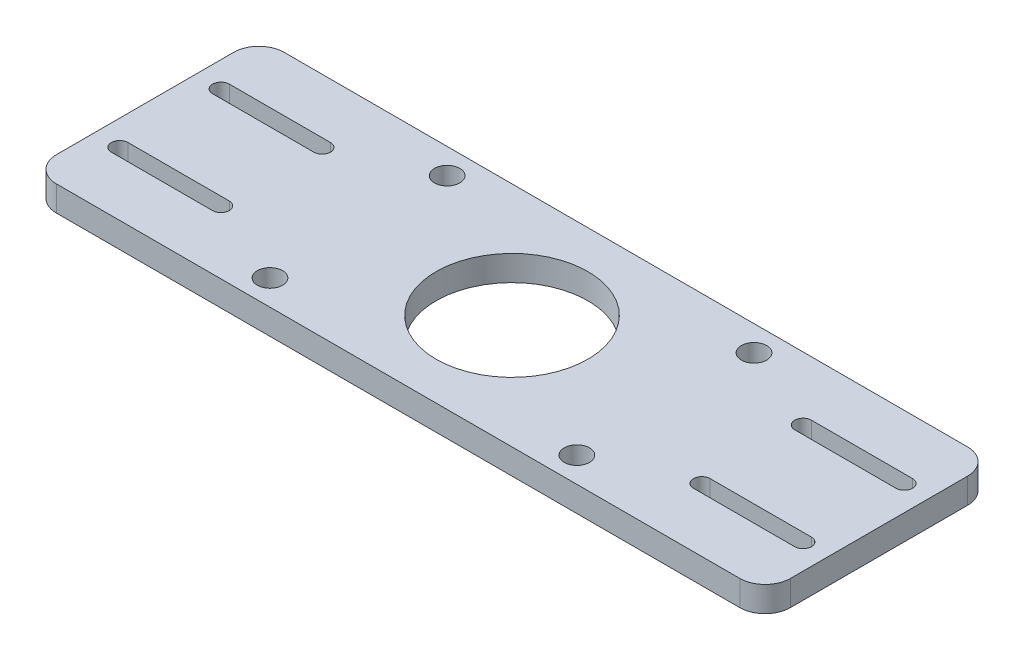
ISO-10303-21;
HEADER;
FILE_DESCRIPTION(('STEP AP214'),'2;1');
FILE_NAME('part.step','',(''),(''),'','','');
FILE_SCHEMA(('AUTOMOTIVE_DESIGN { 1 0 10303 214 1 1 1 1 }'));
ENDSEC;
DATA;
#1=APPLICATION_CONTEXT('core data for automotive mechanical design processes');
#2=APPLICATION_PROTOCOL_DEFINITION('international standard','automotive_design',2000,#1);
#3=PRODUCT_CONTEXT('',#1,'mechanical');
#4=PRODUCT('Part','Part','',(#3));
#5=PRODUCT_RELATED_PRODUCT_CATEGORY('part','',(#4));
#6=PRODUCT_DEFINITION_FORMATION('','',#4);
#7=PRODUCT_DEFINITION_CONTEXT('part definition',#1,'design');
#8=PRODUCT_DEFINITION('design','',#6,#7);
#9=PRODUCT_DEFINITION_SHAPE('','',#8);
#10=(LENGTH_UNIT() NAMED_UNIT(*) SI_UNIT(.MILLI.,.METRE.));
#11=(NAMED_UNIT(*) PLANE_ANGLE_UNIT() SI_UNIT($,.RADIAN.));
#12=(NAMED_UNIT(*) SI_UNIT($,.STERADIAN.) SOLID_ANGLE_UNIT());
#13=UNCERTAINTY_MEASURE_WITH_UNIT(LENGTH_MEASURE(1.E-05),#10,'distance_accuracy_value','');
#14=(GEOMETRIC_REPRESENTATION_CONTEXT(3) GLOBAL_UNCERTAINTY_ASSIGNED_CONTEXT((#13)) GLOBAL_UNIT_ASSIGNED_CONTEXT((#10,
#11,#12)) REPRESENTATION_CONTEXT('',''));
#15=CARTESIAN_POINT('',(0.,0.,0.));
#16=DIRECTION('',(0.,0.,1.));
#17=DIRECTION('',(1.,0.,0.));
#18=AXIS2_PLACEMENT_3D('',#15,#16,#17);
#19=CARTESIAN_POINT('',(67.5,5.,17.5));
#20=DIRECTION('',(0.,1.,0.));
#21=DIRECTION('',(0.,0.,1.));
#22=AXIS2_PLACEMENT_3D('',#19,#20,#21);
#23=CYLINDRICAL_SURFACE('',#22,5.);
#24=DIRECTION('',(0.,1.,0.));
#25=VECTOR('',#24,1.);
#26=CARTESIAN_POINT('',(67.5,5.,22.5));
#27=LINE('',#26,#25);
#28=CARTESIAN_POINT('',(67.5,0.,22.5));
#29=VERTEX_POINT('',#28);
#30=CARTESIAN_POINT('',(67.5,5.,22.5));
#31=VERTEX_POINT('',#30);
#32=EDGE_CURVE('E385',#29,#31,#27,.T.);
#33=ORIENTED_EDGE('',*,*,#32,.F.);
#34=CARTESIAN_POINT('',(67.5,0.,17.5));
#35=DIRECTION('',(0.,1.,0.));
#36=DIRECTION('',(0.,0.,1.));
#37=AXIS2_PLACEMENT_3D('',#34,#35,#36);
#38=CIRCLE('',#37,5.);
#39=CARTESIAN_POINT('',(72.5,0.,17.5));
#40=VERTEX_POINT('',#39);
#41=EDGE_CURVE('E40',#40,#29,#38,.F.);
#42=ORIENTED_EDGE('',*,*,#41,.F.);
#43=DIRECTION('',(0.,1.,0.));
#44=VECTOR('',#43,1.);
#45=CARTESIAN_POINT('',(72.5,5.,17.5));
#46=LINE('',#45,#44);
#47=CARTESIAN_POINT('',(72.5,5.,17.5));
#48=VERTEX_POINT('',#47);
#49=EDGE_CURVE('E388',#48,#40,#46,.F.);
#50=ORIENTED_EDGE('',*,*,#49,.F.);
#51=CARTESIAN_POINT('',(67.5,5.,17.5));
#52=DIRECTION('',(0.,1.,0.));
#53=DIRECTION('',(0.,0.,1.));
#54=AXIS2_PLACEMENT_3D('',#51,#52,#53);
#55=CIRCLE('',#54,5.);
#56=EDGE_CURVE('E11',#31,#48,#55,.T.);
#57=ORIENTED_EDGE('',*,*,#56,.F.);
#58=EDGE_LOOP('',(#33,#42,#50,#57));
#59=FACE_BOUND('',#58,.T.);
#60=ADVANCED_FACE('F33',(#59),#23,.T.);
#61=CARTESIAN_POINT('',(-67.5,5.,17.5));
#62=DIRECTION('',(0.,1.,0.));
#63=DIRECTION('',(0.,0.,1.));
#64=AXIS2_PLACEMENT_3D('',#61,#62,#63);
#65=CYLINDRICAL_SURFACE('',#64,5.);
#66=DIRECTION('',(0.,1.,0.));
#67=VECTOR('',#66,1.);
#68=CARTESIAN_POINT('',(-72.5,5.,17.5));
#69=LINE('',#68,#67);
#70=CARTESIAN_POINT('',(-72.5,0.,17.5));
#71=VERTEX_POINT('',#70);
#72=CARTESIAN_POINT('',(-72.5,5.,17.5));
#73=VERTEX_POINT('',#72);
#74=EDGE_CURVE('E375',#71,#73,#69,.T.);
#75=ORIENTED_EDGE('',*,*,#74,.F.);
#76=CARTESIAN_POINT('',(-67.5,0.,17.5));
#77=DIRECTION('',(0.,1.,0.));
#78=DIRECTION('',(0.,0.,1.));
#79=AXIS2_PLACEMENT_3D('',#76,#77,#78);
#80=CIRCLE('',#79,5.);
#81=CARTESIAN_POINT('',(-67.5,0.,22.5));
#82=VERTEX_POINT('',#81);
#83=EDGE_CURVE('E381',#82,#71,#80,.F.);
#84=ORIENTED_EDGE('',*,*,#83,.F.);
#85=DIRECTION('',(0.,1.,0.));
#86=VECTOR('',#85,1.);
#87=CARTESIAN_POINT('',(-67.5,5.,22.5));
#88=LINE('',#87,#86);
#89=CARTESIAN_POINT('',(-67.5,5.,22.5));
#90=VERTEX_POINT('',#89);
#91=EDGE_CURVE('E378',#90,#82,#88,.F.);
#92=ORIENTED_EDGE('',*,*,#91,.F.);
#93=CARTESIAN_POINT('',(-67.5,5.,17.5));
#94=DIRECTION('',(0.,1.,0.));
#95=DIRECTION('',(0.,0.,1.));
#96=AXIS2_PLACEMENT_3D('',#93,#94,#95);
#97=CIRCLE('',#96,5.);
#98=EDGE_CURVE('E383',#73,#90,#97,.T.);
#99=ORIENTED_EDGE('',*,*,#98,.F.);
#100=EDGE_LOOP('',(#75,#84,#92,#99));
#101=FACE_BOUND('',#100,.T.);
#102=ADVANCED_FACE('F398',(#101),#65,.T.);
#103=CARTESIAN_POINT('',(-67.5,5.,-17.5));
#104=DIRECTION('',(0.,1.,0.));
#105=DIRECTION('',(0.,0.,1.));
#106=AXIS2_PLACEMENT_3D('',#103,#104,#105);
#107=CYLINDRICAL_SURFACE('',#106,5.);
#108=DIRECTION('',(0.,1.,0.));
#109=VECTOR('',#108,1.);
#110=CARTESIAN_POINT('',(-67.5,5.,-22.5));
#111=LINE('',#110,#109);
#112=CARTESIAN_POINT('',(-67.5,0.,-22.5));
#113=VERTEX_POINT('',#112);
#114=CARTESIAN_POINT('',(-67.5,5.,-22.5));
#115=VERTEX_POINT('',#114);
#116=EDGE_CURVE('E365',#113,#115,#111,.T.);
#117=ORIENTED_EDGE('',*,*,#116,.F.);
#118=CARTESIAN_POINT('',(-67.5,0.,-17.5));
#119=DIRECTION('',(0.,1.,0.));
#120=DIRECTION('',(0.,0.,1.));
#121=AXIS2_PLACEMENT_3D('',#118,#119,#120);
#122=CIRCLE('',#121,5.);
#123=CARTESIAN_POINT('',(-72.5,0.,-17.5));
#124=VERTEX_POINT('',#123);
#125=EDGE_CURVE('E371',#124,#113,#122,.F.);
#126=ORIENTED_EDGE('',*,*,#125,.F.);
#127=DIRECTION('',(0.,1.,0.));
#128=VECTOR('',#127,1.);
#129=CARTESIAN_POINT('',(-72.5,5.,-17.5));
#130=LINE('',#129,#128);
#131=CARTESIAN_POINT('',(-72.5,5.,-17.5));
#132=VERTEX_POINT('',#131);
#133=EDGE_CURVE('E368',#132,#124,#130,.F.);
#134=ORIENTED_EDGE('',*,*,#133,.F.);
#135=CARTESIAN_POINT('',(-67.5,5.,-17.5));
#136=DIRECTION('',(0.,1.,0.));
#137=DIRECTION('',(0.,0.,1.));
#138=AXIS2_PLACEMENT_3D('',#135,#136,#137);
#139=CIRCLE('',#138,5.);
#140=EDGE_CURVE('E373',#115,#132,#139,.T.);
#141=ORIENTED_EDGE('',*,*,#140,.F.);
#142=EDGE_LOOP('',(#117,#126,#134,#141));
#143=FACE_BOUND('',#142,.T.);
#144=ADVANCED_FACE('F407',(#143),#107,.T.);
#145=CARTESIAN_POINT('',(67.5,5.,-17.5));
#146=DIRECTION('',(0.,1.,0.));
#147=DIRECTION('',(0.,0.,1.));
#148=AXIS2_PLACEMENT_3D('',#145,#146,#147);
#149=CYLINDRICAL_SURFACE('',#148,5.);
#150=DIRECTION('',(0.,1.,0.));
#151=VECTOR('',#150,1.);
#152=CARTESIAN_POINT('',(72.5,5.,-17.5));
#153=LINE('',#152,#151);
#154=CARTESIAN_POINT('',(72.5,0.,-17.5));
#155=VERTEX_POINT('',#154);
#156=CARTESIAN_POINT('',(72.5,5.,-17.5));
#157=VERTEX_POINT('',#156);
#158=EDGE_CURVE('E345',#155,#157,#153,.T.);
#159=ORIENTED_EDGE('',*,*,#158,.F.);
#160=CARTESIAN_POINT('',(67.5,0.,-17.5));
#161=DIRECTION('',(0.,1.,0.));
#162=DIRECTION('',(0.,0.,1.));
#163=AXIS2_PLACEMENT_3D('',#160,#161,#162);
#164=CIRCLE('',#163,5.);
#165=CARTESIAN_POINT('',(67.5,0.,-22.5));
#166=VERTEX_POINT('',#165);
#167=EDGE_CURVE('E360',#166,#155,#164,.F.);
#168=ORIENTED_EDGE('',*,*,#167,.F.);
#169=DIRECTION('',(0.,1.,0.));
#170=VECTOR('',#169,1.);
#171=CARTESIAN_POINT('',(67.5,5.,-22.5));
#172=LINE('',#171,#170);
#173=CARTESIAN_POINT('',(67.5,5.,-22.5));
#174=VERTEX_POINT('',#173);
#175=EDGE_CURVE('E357',#174,#166,#172,.F.);
#176=ORIENTED_EDGE('',*,*,#175,.F.);
#177=CARTESIAN_POINT('',(67.5,5.,-17.5));
#178=DIRECTION('',(0.,1.,0.));
#179=DIRECTION('',(0.,0.,1.));
#180=AXIS2_PLACEMENT_3D('',#177,#178,#179);
#181=CIRCLE('',#180,5.);
#182=EDGE_CURVE('E363',#157,#174,#181,.T.);
#183=ORIENTED_EDGE('',*,*,#182,.F.);
#184=EDGE_LOOP('',(#159,#168,#176,#183));
#185=FACE_BOUND('',#184,.T.);
#186=ADVANCED_FACE('F415',(#185),#149,.T.);
#187=CARTESIAN_POINT('',(-72.5,5.,22.5));
#188=DIRECTION('',(1.,0.,0.));
#189=DIRECTION('',(0.,0.,-1.));
#190=AXIS2_PLACEMENT_3D('',#187,#188,#189);
#191=PLANE('',#190);
#192=DIRECTION('',(0.,0.,1.));
#193=VECTOR('',#192,1.);
#194=CARTESIAN_POINT('',(-72.5,0.,22.5));
#195=LINE('',#194,#193);
#196=EDGE_CURVE('E327',#124,#71,#195,.T.);
#197=ORIENTED_EDGE('',*,*,#196,.T.);
#198=ORIENTED_EDGE('',*,*,#74,.T.);
#199=DIRECTION('',(0.,0.,1.));
#200=VECTOR('',#199,1.);
#201=CARTESIAN_POINT('',(-72.5,5.,22.5));
#202=LINE('',#201,#200);
#203=EDGE_CURVE('E334',#132,#73,#202,.T.);
#204=ORIENTED_EDGE('',*,*,#203,.F.);
#205=ORIENTED_EDGE('',*,*,#133,.T.);
#206=EDGE_LOOP('',(#197,#198,#204,#205));
#207=FACE_BOUND('',#206,.T.);
#208=ADVANCED_FACE('F403',(#207),#191,.F.);
#209=CARTESIAN_POINT('',(72.5,5.,22.5));
#210=DIRECTION('',(0.,0.,-1.));
#211=DIRECTION('',(-1.,0.,0.));
#212=AXIS2_PLACEMENT_3D('',#209,#210,#211);
#213=PLANE('',#212);
#214=DIRECTION('',(1.,0.,0.));
#215=VECTOR('',#214,1.);
#216=CARTESIAN_POINT('',(72.5,0.,22.5));
#217=LINE('',#216,#215);
#218=EDGE_CURVE('E348',#82,#29,#217,.T.);
#219=ORIENTED_EDGE('',*,*,#218,.T.);
#220=ORIENTED_EDGE('',*,*,#32,.T.);
#221=DIRECTION('',(1.,0.,0.));
#222=VECTOR('',#221,1.);
#223=CARTESIAN_POINT('',(72.5,5.,22.5));
#224=LINE('',#223,#222);
#225=EDGE_CURVE('E337',#90,#31,#224,.T.);
#226=ORIENTED_EDGE('',*,*,#225,.F.);
#227=ORIENTED_EDGE('',*,*,#91,.T.);
#228=EDGE_LOOP('',(#219,#220,#226,#227));
#229=FACE_BOUND('',#228,.T.);
#230=ADVANCED_FACE('F394',(#229),#213,.F.);
#231=CARTESIAN_POINT('',(72.5,5.,22.5));
#232=DIRECTION('',(-1.,0.,0.));
#233=DIRECTION('',(0.,0.,1.));
#234=AXIS2_PLACEMENT_3D('',#231,#232,#233);
#235=PLANE('',#234);
#236=DIRECTION('',(0.,0.,-1.));
#237=VECTOR('',#236,1.);
#238=CARTESIAN_POINT('',(72.5,5.,22.5));
#239=LINE('',#238,#237);
#240=EDGE_CURVE('E340',#48,#157,#239,.T.);
#241=ORIENTED_EDGE('',*,*,#240,.F.);
#242=ORIENTED_EDGE('',*,*,#49,.T.);
#243=DIRECTION('',(0.,0.,-1.));
#244=VECTOR('',#243,1.);
#245=CARTESIAN_POINT('',(72.5,0.,22.5));
#246=LINE('',#245,#244);
#247=EDGE_CURVE('E351',#40,#155,#246,.T.);
#248=ORIENTED_EDGE('',*,*,#247,.T.);
#249=ORIENTED_EDGE('',*,*,#158,.T.);
#250=EDGE_LOOP('',(#241,#242,#248,#249));
#251=FACE_BOUND('',#250,.T.);
#252=ADVANCED_FACE('F418',(#251),#235,.F.);
#253=CARTESIAN_POINT('',(72.5,5.,-22.5));
#254=DIRECTION('',(0.,0.,1.));
#255=DIRECTION('',(1.,0.,0.));
#256=AXIS2_PLACEMENT_3D('',#253,#254,#255);
#257=PLANE('',#256);
#258=DIRECTION('',(-1.,0.,0.));
#259=VECTOR('',#258,1.);
#260=CARTESIAN_POINT('',(72.5,0.,-22.5));
#261=LINE('',#260,#259);
#262=EDGE_CURVE('E338',#166,#113,#261,.T.);
#263=ORIENTED_EDGE('',*,*,#262,.T.);
#264=ORIENTED_EDGE('',*,*,#116,.T.);
#265=DIRECTION('',(-1.,0.,0.));
#266=VECTOR('',#265,1.);
#267=CARTESIAN_POINT('',(72.5,5.,-22.5));
#268=LINE('',#267,#266);
#269=EDGE_CURVE('E342',#174,#115,#268,.T.);
#270=ORIENTED_EDGE('',*,*,#269,.F.);
#271=ORIENTED_EDGE('',*,*,#175,.T.);
#272=EDGE_LOOP('',(#263,#264,#270,#271));
#273=FACE_BOUND('',#272,.T.);
#274=ADVANCED_FACE('F410',(#273),#257,.F.);
#275=CARTESIAN_POINT('',(0.,5.,0.));
#276=DIRECTION('',(0.,1.,0.));
#277=DIRECTION('',(0.,0.,1.));
#278=AXIS2_PLACEMENT_3D('',#275,#276,#277);
#279=PLANE('',#278);
#280=CARTESIAN_POINT('',(0.,5.,0.));
#281=DIRECTION('',(0.,1.,0.));
#282=DIRECTION('',(0.,0.,1.));
#283=AXIS2_PLACEMENT_3D('',#280,#281,#282);
#284=CIRCLE('',#283,15.);
#285=CARTESIAN_POINT('',(0.,5.,15.));
#286=VERTEX_POINT('',#285);
#287=EDGE_CURVE('E745',#286,#286,#284,.T.);
#288=ORIENTED_EDGE('',*,*,#287,.F.);
#289=EDGE_LOOP('',(#288));
#290=FACE_BOUND('',#289,.T.);
#291=CARTESIAN_POINT('',(-30.3108891324546,5.,-17.4999999999987));
#292=DIRECTION('',(0.,1.,0.));
#293=DIRECTION('',(0.,0.,1.));
#294=AXIS2_PLACEMENT_3D('',#291,#292,#293);
#295=CIRCLE('',#294,2.50000000000151);
#296=CARTESIAN_POINT('',(-30.3108891324546,5.,-14.9999999999972));
#297=VERTEX_POINT('',#296);
#298=EDGE_CURVE('E747',#297,#297,#295,.T.);
#299=ORIENTED_EDGE('',*,*,#298,.F.);
#300=EDGE_LOOP('',(#299));
#301=FACE_BOUND('',#300,.T.);
#302=CARTESIAN_POINT('',(-30.3108891324531,5.,17.5000000000013));
#303=DIRECTION('',(0.,1.,0.));
#304=DIRECTION('',(0.,0.,1.));
#305=AXIS2_PLACEMENT_3D('',#302,#303,#304);
#306=CIRCLE('',#305,2.50000000000283);
#307=CARTESIAN_POINT('',(-30.3108891324531,5.,20.0000000000041));
#308=VERTEX_POINT('',#307);
#309=EDGE_CURVE('E753',#308,#308,#306,.T.);
#310=ORIENTED_EDGE('',*,*,#309,.F.);
#311=EDGE_LOOP('',(#310));
#312=FACE_BOUND('',#311,.T.);
#313=CARTESIAN_POINT('',(30.3108891324576,5.,17.4999999999987));
#314=DIRECTION('',(0.,1.,0.));
#315=DIRECTION('',(0.,0.,1.));
#316=AXIS2_PLACEMENT_3D('',#313,#314,#315);
#317=CIRCLE('',#316,2.50000000000192);
#318=CARTESIAN_POINT('',(30.3108891324576,5.,20.0000000000006));
#319=VERTEX_POINT('',#318);
#320=EDGE_CURVE('E759',#319,#319,#317,.T.);
#321=ORIENTED_EDGE('',*,*,#320,.F.);
#322=EDGE_LOOP('',(#321));
#323=FACE_BOUND('',#322,.T.);
#324=CARTESIAN_POINT('',(30.3108891324561,5.,-17.5000000000013));
#325=DIRECTION('',(0.,1.,0.));
#326=DIRECTION('',(0.,0.,1.));
#327=AXIS2_PLACEMENT_3D('',#324,#325,#326);
#328=CIRCLE('',#327,2.50000000000043);
#329=CARTESIAN_POINT('',(30.3108891324561,5.,-15.0000000000009));
#330=VERTEX_POINT('',#329);
#331=EDGE_CURVE('E221',#330,#330,#328,.T.);
#332=ORIENTED_EDGE('',*,*,#331,.F.);
#333=EDGE_LOOP('',(#332));
#334=FACE_BOUND('',#333,.T.);
#335=CARTESIAN_POINT('',(47.5,5.,9.99999999999999));
#336=DIRECTION('',(0.,1.,0.));
#337=DIRECTION('',(0.,0.,1.));
#338=AXIS2_PLACEMENT_3D('',#335,#336,#337);
#339=CIRCLE('',#338,1.65);
#340=CARTESIAN_POINT('',(47.5,5.,8.34999999999999));
#341=VERTEX_POINT('',#340);
#342=CARTESIAN_POINT('',(47.5,5.,11.65));
#343=VERTEX_POINT('',#342);
#344=EDGE_CURVE('E197',#341,#343,#339,.T.);
#345=ORIENTED_EDGE('',*,*,#344,.F.);
#346=DIRECTION('',(-1.,0.,0.));
#347=VECTOR('',#346,1.);
#348=CARTESIAN_POINT('',(67.5,5.,8.34999999999998));
#349=LINE('',#348,#347);
#350=CARTESIAN_POINT('',(67.5,5.,8.34999999999998));
#351=VERTEX_POINT('',#350);
#352=EDGE_CURVE('E215',#351,#341,#349,.T.);
#353=ORIENTED_EDGE('',*,*,#352,.F.);
#354=CARTESIAN_POINT('',(67.5,5.,9.99999999999998));
#355=DIRECTION('',(0.,1.,0.));
#356=DIRECTION('',(0.,0.,1.));
#357=AXIS2_PLACEMENT_3D('',#354,#355,#356);
#358=CIRCLE('',#357,1.65);
#359=CARTESIAN_POINT('',(67.5,5.,11.65));
#360=VERTEX_POINT('',#359);
#361=EDGE_CURVE('E218',#360,#351,#358,.T.);
#362=ORIENTED_EDGE('',*,*,#361,.F.);
#363=DIRECTION('',(1.,0.,0.));
#364=VECTOR('',#363,1.);
#365=CARTESIAN_POINT('',(47.5,5.,11.65));
#366=LINE('',#365,#364);
#367=EDGE_CURVE('E227',#343,#360,#366,.T.);
#368=ORIENTED_EDGE('',*,*,#367,.F.);
#369=EDGE_LOOP('',(#345,#353,#362,#368));
#370=FACE_BOUND('',#369,.T.);
#371=CARTESIAN_POINT('',(47.5,5.,-9.99999999999999));
#372=DIRECTION('',(0.,1.,0.));
#373=DIRECTION('',(0.,0.,-1.));
#374=AXIS2_PLACEMENT_3D('',#371,#372,#373);
#375=CIRCLE('',#374,1.65);
#376=CARTESIAN_POINT('',(47.5,5.,-11.65));
#377=VERTEX_POINT('',#376);
#378=CARTESIAN_POINT('',(47.5,5.,-8.34999999999999));
#379=VERTEX_POINT('',#378);
#380=EDGE_CURVE('E234',#377,#379,#375,.T.);
#381=ORIENTED_EDGE('',*,*,#380,.F.);
#382=DIRECTION('',(-1.,0.,0.));
#383=VECTOR('',#382,1.);
#384=CARTESIAN_POINT('',(47.5,5.,-11.65));
#385=LINE('',#384,#383);
#386=CARTESIAN_POINT('',(67.5,5.,-11.65));
#387=VERTEX_POINT('',#386);
#388=EDGE_CURVE('E242',#387,#377,#385,.T.);
#389=ORIENTED_EDGE('',*,*,#388,.F.);
#390=CARTESIAN_POINT('',(67.5,5.,-9.99999999999998));
#391=DIRECTION('',(0.,1.,0.));
#392=DIRECTION('',(0.,0.,-1.));
#393=AXIS2_PLACEMENT_3D('',#390,#391,#392);
#394=CIRCLE('',#393,1.65);
#395=CARTESIAN_POINT('',(67.5,5.,-8.34999999999998));
#396=VERTEX_POINT('',#395);
#397=EDGE_CURVE('E256',#396,#387,#394,.T.);
#398=ORIENTED_EDGE('',*,*,#397,.F.);
#399=DIRECTION('',(1.,0.,0.));
#400=VECTOR('',#399,1.);
#401=CARTESIAN_POINT('',(67.5,5.,-8.34999999999998));
#402=LINE('',#401,#400);
#403=EDGE_CURVE('E253',#379,#396,#402,.T.);
#404=ORIENTED_EDGE('',*,*,#403,.F.);
#405=EDGE_LOOP('',(#381,#389,#398,#404));
#406=FACE_BOUND('',#405,.T.);
#407=CARTESIAN_POINT('',(-67.5,5.,-10.));
#408=DIRECTION('',(0.,1.,0.));
#409=DIRECTION('',(0.,0.,1.));
#410=AXIS2_PLACEMENT_3D('',#407,#408,#409);
#411=CIRCLE('',#410,1.65);
#412=CARTESIAN_POINT('',(-67.5,5.,-11.65));
#413=VERTEX_POINT('',#412);
#414=CARTESIAN_POINT('',(-67.5,5.,-8.35));
#415=VERTEX_POINT('',#414);
#416=EDGE_CURVE('E263',#413,#415,#411,.T.);
#417=ORIENTED_EDGE('',*,*,#416,.F.);
#418=DIRECTION('',(-1.,0.,0.));
#419=VECTOR('',#418,1.);
#420=CARTESIAN_POINT('',(-47.5,5.,-11.65));
#421=LINE('',#420,#419);
#422=CARTESIAN_POINT('',(-47.5,5.,-11.65));
#423=VERTEX_POINT('',#422);
#424=EDGE_CURVE('E274',#423,#413,#421,.T.);
#425=ORIENTED_EDGE('',*,*,#424,.F.);
#426=CARTESIAN_POINT('',(-47.5,5.,-10.));
#427=DIRECTION('',(0.,1.,0.));
#428=DIRECTION('',(0.,0.,1.));
#429=AXIS2_PLACEMENT_3D('',#426,#427,#428);
#430=CIRCLE('',#429,1.65);
#431=CARTESIAN_POINT('',(-47.5,5.,-8.35));
#432=VERTEX_POINT('',#431);
#433=EDGE_CURVE('E288',#432,#423,#430,.T.);
#434=ORIENTED_EDGE('',*,*,#433,.F.);
#435=DIRECTION('',(1.,0.,0.));
#436=VECTOR('',#435,1.);
#437=CARTESIAN_POINT('',(-67.5,5.,-8.35));
#438=LINE('',#437,#436);
#439=EDGE_CURVE('E285',#415,#432,#438,.T.);
#440=ORIENTED_EDGE('',*,*,#439,.F.);
#441=EDGE_LOOP('',(#417,#425,#434,#440));
#442=FACE_BOUND('',#441,.T.);
#443=CARTESIAN_POINT('',(-47.5,5.,10.));
#444=DIRECTION('',(0.,1.,0.));
#445=DIRECTION('',(0.,0.,-1.));
#446=AXIS2_PLACEMENT_3D('',#443,#444,#445);
#447=CIRCLE('',#446,1.65);
#448=CARTESIAN_POINT('',(-47.5,5.,11.65));
#449=VERTEX_POINT('',#448);
#450=CARTESIAN_POINT('',(-47.5,5.,8.35));
#451=VERTEX_POINT('',#450);
#452=EDGE_CURVE('E295',#449,#451,#447,.T.);
#453=ORIENTED_EDGE('',*,*,#452,.F.);
#454=DIRECTION('',(1.,0.,0.));
#455=VECTOR('',#454,1.);
#456=CARTESIAN_POINT('',(-47.5,5.,11.65));
#457=LINE('',#456,#455);
#458=CARTESIAN_POINT('',(-67.5,5.,11.65));
#459=VERTEX_POINT('',#458);
#460=EDGE_CURVE('E306',#459,#449,#457,.T.);
#461=ORIENTED_EDGE('',*,*,#460,.F.);
#462=CARTESIAN_POINT('',(-67.5,5.,10.));
#463=DIRECTION('',(0.,1.,0.));
#464=DIRECTION('',(0.,0.,-1.));
#465=AXIS2_PLACEMENT_3D('',#462,#463,#464);
#466=CIRCLE('',#465,1.65);
#467=CARTESIAN_POINT('',(-67.5,5.,8.35));
#468=VERTEX_POINT('',#467);
#469=EDGE_CURVE('E320',#468,#459,#466,.T.);
#470=ORIENTED_EDGE('',*,*,#469,.F.);
#471=DIRECTION('',(-1.,0.,0.));
#472=VECTOR('',#471,1.);
#473=CARTESIAN_POINT('',(-67.5,5.,8.35));
#474=LINE('',#473,#472);
#475=EDGE_CURVE('E317',#451,#468,#474,.T.);
#476=ORIENTED_EDGE('',*,*,#475,.F.);
#477=EDGE_LOOP('',(#453,#461,#470,#476));
#478=FACE_BOUND('',#477,.T.);
#479=ORIENTED_EDGE('',*,*,#225,.T.);
#480=ORIENTED_EDGE('',*,*,#56,.T.);
#481=ORIENTED_EDGE('',*,*,#240,.T.);
#482=ORIENTED_EDGE('',*,*,#182,.T.);
#483=ORIENTED_EDGE('',*,*,#269,.T.);
#484=ORIENTED_EDGE('',*,*,#140,.T.);
#485=ORIENTED_EDGE('',*,*,#203,.T.);
#486=ORIENTED_EDGE('',*,*,#98,.T.);
#487=EDGE_LOOP('',(#479,#480,#481,#482,#483,#484,#485,#486));
#488=FACE_BOUND('',#487,.T.);
#489=ADVANCED_FACE('F419',(#290,#301,#312,#323,#334,#370,#406,#442,#478,#488),#279,.T.);
#490=CARTESIAN_POINT('',(0.,0.,0.));
#491=DIRECTION('',(0.,1.,0.));
#492=DIRECTION('',(0.,0.,1.));
#493=AXIS2_PLACEMENT_3D('',#490,#491,#492);
#494=PLANE('',#493);
#495=CARTESIAN_POINT('',(0.,0.,0.));
#496=DIRECTION('',(0.,1.,0.));
#497=DIRECTION('',(0.,0.,1.));
#498=AXIS2_PLACEMENT_3D('',#495,#496,#497);
#499=CIRCLE('',#498,15.);
#500=CARTESIAN_POINT('',(0.,0.,15.));
#501=VERTEX_POINT('',#500);
#502=EDGE_CURVE('E743',#501,#501,#499,.T.);
#503=ORIENTED_EDGE('',*,*,#502,.T.);
#504=EDGE_LOOP('',(#503));
#505=FACE_BOUND('',#504,.T.);
#506=CARTESIAN_POINT('',(-30.3108891324546,0.,-17.4999999999987));
#507=DIRECTION('',(0.,1.,0.));
#508=DIRECTION('',(0.,0.,1.));
#509=AXIS2_PLACEMENT_3D('',#506,#507,#508);
#510=CIRCLE('',#509,2.50000000000151);
#511=CARTESIAN_POINT('',(-30.3108891324546,0.,-14.9999999999972));
#512=VERTEX_POINT('',#511);
#513=EDGE_CURVE('E750',#512,#512,#510,.T.);
#514=ORIENTED_EDGE('',*,*,#513,.T.);
#515=EDGE_LOOP('',(#514));
#516=FACE_BOUND('',#515,.T.);
#517=CARTESIAN_POINT('',(-30.3108891324531,0.,17.5000000000013));
#518=DIRECTION('',(0.,1.,0.));
#519=DIRECTION('',(0.,0.,1.));
#520=AXIS2_PLACEMENT_3D('',#517,#518,#519);
#521=CIRCLE('',#520,2.50000000000283);
#522=CARTESIAN_POINT('',(-30.3108891324531,0.,20.0000000000041));
#523=VERTEX_POINT('',#522);
#524=EDGE_CURVE('E756',#523,#523,#521,.T.);
#525=ORIENTED_EDGE('',*,*,#524,.T.);
#526=EDGE_LOOP('',(#525));
#527=FACE_BOUND('',#526,.T.);
#528=CARTESIAN_POINT('',(30.3108891324576,0.,17.4999999999987));
#529=DIRECTION('',(0.,1.,0.));
#530=DIRECTION('',(0.,0.,1.));
#531=AXIS2_PLACEMENT_3D('',#528,#529,#530);
#532=CIRCLE('',#531,2.50000000000192);
#533=CARTESIAN_POINT('',(30.3108891324576,0.,20.0000000000006));
#534=VERTEX_POINT('',#533);
#535=EDGE_CURVE('E762',#534,#534,#532,.T.);
#536=ORIENTED_EDGE('',*,*,#535,.T.);
#537=EDGE_LOOP('',(#536));
#538=FACE_BOUND('',#537,.T.);
#539=CARTESIAN_POINT('',(30.3108891324561,0.,-17.5000000000013));
#540=DIRECTION('',(0.,1.,0.));
#541=DIRECTION('',(0.,0.,1.));
#542=AXIS2_PLACEMENT_3D('',#539,#540,#541);
#543=CIRCLE('',#542,2.50000000000043);
#544=CARTESIAN_POINT('',(30.3108891324561,0.,-15.0000000000009));
#545=VERTEX_POINT('',#544);
#546=EDGE_CURVE('E228',#545,#545,#543,.T.);
#547=ORIENTED_EDGE('',*,*,#546,.T.);
#548=EDGE_LOOP('',(#547));
#549=FACE_BOUND('',#548,.T.);
#550=DIRECTION('',(-1.,0.,0.));
#551=VECTOR('',#550,1.);
#552=CARTESIAN_POINT('',(67.5,0.,8.34999999999998));
#553=LINE('',#552,#551);
#554=CARTESIAN_POINT('',(67.5,0.,8.34999999999998));
#555=VERTEX_POINT('',#554);
#556=CARTESIAN_POINT('',(47.5,0.,8.34999999999999));
#557=VERTEX_POINT('',#556);
#558=EDGE_CURVE('E202',#555,#557,#553,.T.);
#559=ORIENTED_EDGE('',*,*,#558,.T.);
#560=CARTESIAN_POINT('',(47.5,0.,9.99999999999999));
#561=DIRECTION('',(0.,1.,0.));
#562=DIRECTION('',(0.,0.,1.));
#563=AXIS2_PLACEMENT_3D('',#560,#561,#562);
#564=CIRCLE('',#563,1.65);
#565=CARTESIAN_POINT('',(47.5,0.,11.65));
#566=VERTEX_POINT('',#565);
#567=EDGE_CURVE('E194',#557,#566,#564,.T.);
#568=ORIENTED_EDGE('',*,*,#567,.T.);
#569=DIRECTION('',(1.,0.,0.));
#570=VECTOR('',#569,1.);
#571=CARTESIAN_POINT('',(47.5,0.,11.65));
#572=LINE('',#571,#570);
#573=CARTESIAN_POINT('',(67.5,0.,11.65));
#574=VERTEX_POINT('',#573);
#575=EDGE_CURVE('E206',#566,#574,#572,.T.);
#576=ORIENTED_EDGE('',*,*,#575,.T.);
#577=CARTESIAN_POINT('',(67.5,0.,9.99999999999998));
#578=DIRECTION('',(0.,1.,0.));
#579=DIRECTION('',(0.,0.,1.));
#580=AXIS2_PLACEMENT_3D('',#577,#578,#579);
#581=CIRCLE('',#580,1.65);
#582=EDGE_CURVE('E210',#574,#555,#581,.T.);
#583=ORIENTED_EDGE('',*,*,#582,.T.);
#584=EDGE_LOOP('',(#559,#568,#576,#583));
#585=FACE_BOUND('',#584,.T.);
#586=DIRECTION('',(-1.,0.,0.));
#587=VECTOR('',#586,1.);
#588=CARTESIAN_POINT('',(47.5,0.,-11.65));
#589=LINE('',#588,#587);
#590=CARTESIAN_POINT('',(67.5,0.,-11.65));
#591=VERTEX_POINT('',#590);
#592=CARTESIAN_POINT('',(47.5,0.,-11.65));
#593=VERTEX_POINT('',#592);
#594=EDGE_CURVE('E248',#591,#593,#589,.T.);
#595=ORIENTED_EDGE('',*,*,#594,.T.);
#596=CARTESIAN_POINT('',(47.5,0.,-9.99999999999999));
#597=DIRECTION('',(0.,1.,0.));
#598=DIRECTION('',(0.,0.,-1.));
#599=AXIS2_PLACEMENT_3D('',#596,#597,#598);
#600=CIRCLE('',#599,1.65);
#601=CARTESIAN_POINT('',(47.5,0.,-8.34999999999999));
#602=VERTEX_POINT('',#601);
#603=EDGE_CURVE('E238',#593,#602,#600,.T.);
#604=ORIENTED_EDGE('',*,*,#603,.T.);
#605=DIRECTION('',(1.,0.,0.));
#606=VECTOR('',#605,1.);
#607=CARTESIAN_POINT('',(67.5,0.,-8.34999999999998));
#608=LINE('',#607,#606);
#609=CARTESIAN_POINT('',(67.5,0.,-8.34999999999998));
#610=VERTEX_POINT('',#609);
#611=EDGE_CURVE('E241',#602,#610,#608,.T.);
#612=ORIENTED_EDGE('',*,*,#611,.T.);
#613=CARTESIAN_POINT('',(67.5,0.,-9.99999999999998));
#614=DIRECTION('',(0.,1.,0.));
#615=DIRECTION('',(0.,0.,-1.));
#616=AXIS2_PLACEMENT_3D('',#613,#614,#615);
#617=CIRCLE('',#616,1.65);
#618=EDGE_CURVE('E245',#610,#591,#617,.T.);
#619=ORIENTED_EDGE('',*,*,#618,.T.);
#620=EDGE_LOOP('',(#595,#604,#612,#619));
#621=FACE_BOUND('',#620,.T.);
#622=DIRECTION('',(-1.,0.,0.));
#623=VECTOR('',#622,1.);
#624=CARTESIAN_POINT('',(-47.5,0.,-11.65));
#625=LINE('',#624,#623);
#626=CARTESIAN_POINT('',(-47.5,0.,-11.65));
#627=VERTEX_POINT('',#626);
#628=CARTESIAN_POINT('',(-67.5,0.,-11.65));
#629=VERTEX_POINT('',#628);
#630=EDGE_CURVE('E280',#627,#629,#625,.T.);
#631=ORIENTED_EDGE('',*,*,#630,.T.);
#632=CARTESIAN_POINT('',(-67.5,0.,-10.));
#633=DIRECTION('',(0.,1.,0.));
#634=DIRECTION('',(0.,0.,1.));
#635=AXIS2_PLACEMENT_3D('',#632,#633,#634);
#636=CIRCLE('',#635,1.65);
#637=CARTESIAN_POINT('',(-67.5,0.,-8.35));
#638=VERTEX_POINT('',#637);
#639=EDGE_CURVE('E270',#629,#638,#636,.T.);
#640=ORIENTED_EDGE('',*,*,#639,.T.);
#641=DIRECTION('',(1.,0.,0.));
#642=VECTOR('',#641,1.);
#643=CARTESIAN_POINT('',(-67.5,0.,-8.35));
#644=LINE('',#643,#642);
#645=CARTESIAN_POINT('',(-47.5,0.,-8.35));
#646=VERTEX_POINT('',#645);
#647=EDGE_CURVE('E273',#638,#646,#644,.T.);
#648=ORIENTED_EDGE('',*,*,#647,.T.);
#649=CARTESIAN_POINT('',(-47.5,0.,-10.));
#650=DIRECTION('',(0.,1.,0.));
#651=DIRECTION('',(0.,0.,1.));
#652=AXIS2_PLACEMENT_3D('',#649,#650,#651);
#653=CIRCLE('',#652,1.65);
#654=EDGE_CURVE('E277',#646,#627,#653,.T.);
#655=ORIENTED_EDGE('',*,*,#654,.T.);
#656=EDGE_LOOP('',(#631,#640,#648,#655));
#657=FACE_BOUND('',#656,.T.);
#658=DIRECTION('',(1.,0.,0.));
#659=VECTOR('',#658,1.);
#660=CARTESIAN_POINT('',(-47.5,0.,11.65));
#661=LINE('',#660,#659);
#662=CARTESIAN_POINT('',(-67.5,0.,11.65));
#663=VERTEX_POINT('',#662);
#664=CARTESIAN_POINT('',(-47.5,0.,11.65));
#665=VERTEX_POINT('',#664);
#666=EDGE_CURVE('E312',#663,#665,#661,.T.);
#667=ORIENTED_EDGE('',*,*,#666,.T.);
#668=CARTESIAN_POINT('',(-47.5,0.,10.));
#669=DIRECTION('',(0.,1.,0.));
#670=DIRECTION('',(0.,0.,-1.));
#671=AXIS2_PLACEMENT_3D('',#668,#669,#670);
#672=CIRCLE('',#671,1.65);
#673=CARTESIAN_POINT('',(-47.5,0.,8.35));
#674=VERTEX_POINT('',#673);
#675=EDGE_CURVE('E302',#665,#674,#672,.T.);
#676=ORIENTED_EDGE('',*,*,#675,.T.);
#677=DIRECTION('',(-1.,0.,0.));
#678=VECTOR('',#677,1.);
#679=CARTESIAN_POINT('',(-67.5,0.,8.35));
#680=LINE('',#679,#678);
#681=CARTESIAN_POINT('',(-67.5,0.,8.35));
#682=VERTEX_POINT('',#681);
#683=EDGE_CURVE('E305',#674,#682,#680,.T.);
#684=ORIENTED_EDGE('',*,*,#683,.T.);
#685=CARTESIAN_POINT('',(-67.5,0.,10.));
#686=DIRECTION('',(0.,1.,0.));
#687=DIRECTION('',(0.,0.,-1.));
#688=AXIS2_PLACEMENT_3D('',#685,#686,#687);
#689=CIRCLE('',#688,1.65);
#690=EDGE_CURVE('E309',#682,#663,#689,.T.);
#691=ORIENTED_EDGE('',*,*,#690,.T.);
#692=EDGE_LOOP('',(#667,#676,#684,#691));
#693=FACE_BOUND('',#692,.T.);
#694=ORIENTED_EDGE('',*,*,#247,.F.);
#695=ORIENTED_EDGE('',*,*,#41,.T.);
#696=ORIENTED_EDGE('',*,*,#218,.F.);
#697=ORIENTED_EDGE('',*,*,#83,.T.);
#698=ORIENTED_EDGE('',*,*,#196,.F.);
#699=ORIENTED_EDGE('',*,*,#125,.T.);
#700=ORIENTED_EDGE('',*,*,#262,.F.);
#701=ORIENTED_EDGE('',*,*,#167,.T.);
#702=EDGE_LOOP('',(#694,#695,#696,#697,#698,#699,#700,#701));
#703=FACE_BOUND('',#702,.T.);
#704=ADVANCED_FACE('F212',(#505,#516,#527,#538,#549,#585,#621,#657,#693,#703),#494,.F.);
#705=CARTESIAN_POINT('',(-47.5,0.,10.));
#706=DIRECTION('',(0.,1.,0.));
#707=DIRECTION('',(0.,0.,1.));
#708=AXIS2_PLACEMENT_3D('',#705,#706,#707);
#709=CYLINDRICAL_SURFACE('',#708,1.65);
#710=ORIENTED_EDGE('',*,*,#452,.T.);
#711=DIRECTION('',(0.,1.,0.));
#712=VECTOR('',#711,1.);
#713=CARTESIAN_POINT('',(-47.5,0.,8.35));
#714=LINE('',#713,#712);
#715=EDGE_CURVE('E315',#674,#451,#714,.T.);
#716=ORIENTED_EDGE('',*,*,#715,.F.);
#717=ORIENTED_EDGE('',*,*,#675,.F.);
#718=DIRECTION('',(0.,1.,0.));
#719=VECTOR('',#718,1.);
#720=CARTESIAN_POINT('',(-47.5,0.,11.65));
#721=LINE('',#720,#719);
#722=EDGE_CURVE('E325',#665,#449,#721,.T.);
#723=ORIENTED_EDGE('',*,*,#722,.T.);
#724=EDGE_LOOP('',(#710,#716,#717,#723));
#725=FACE_BOUND('',#724,.T.);
#726=ADVANCED_FACE('F427',(#725),#709,.F.);
#727=CARTESIAN_POINT('',(-47.5,0.,11.65));
#728=DIRECTION('',(0.,0.,1.));
#729=DIRECTION('',(1.,0.,0.));
#730=AXIS2_PLACEMENT_3D('',#727,#728,#729);
#731=PLANE('',#730);
#732=ORIENTED_EDGE('',*,*,#460,.T.);
#733=ORIENTED_EDGE('',*,*,#722,.F.);
#734=ORIENTED_EDGE('',*,*,#666,.F.);
#735=DIRECTION('',(0.,1.,0.));
#736=VECTOR('',#735,1.);
#737=CARTESIAN_POINT('',(-67.5,0.,11.65));
#738=LINE('',#737,#736);
#739=EDGE_CURVE('E328',#663,#459,#738,.T.);
#740=ORIENTED_EDGE('',*,*,#739,.T.);
#741=EDGE_LOOP('',(#732,#733,#734,#740));
#742=FACE_BOUND('',#741,.T.);
#743=ADVANCED_FACE('F547',(#742),#731,.F.);
#744=CARTESIAN_POINT('',(-67.5,0.,10.));
#745=DIRECTION('',(0.,1.,0.));
#746=DIRECTION('',(0.,0.,1.));
#747=AXIS2_PLACEMENT_3D('',#744,#745,#746);
#748=CYLINDRICAL_SURFACE('',#747,1.65);
#749=ORIENTED_EDGE('',*,*,#469,.T.);
#750=ORIENTED_EDGE('',*,*,#739,.F.);
#751=ORIENTED_EDGE('',*,*,#690,.F.);
#752=DIRECTION('',(0.,1.,0.));
#753=VECTOR('',#752,1.);
#754=CARTESIAN_POINT('',(-67.5,0.,8.35));
#755=LINE('',#754,#753);
#756=EDGE_CURVE('E330',#682,#468,#755,.T.);
#757=ORIENTED_EDGE('',*,*,#756,.T.);
#758=EDGE_LOOP('',(#749,#750,#751,#757));
#759=FACE_BOUND('',#758,.T.);
#760=ADVANCED_FACE('F553',(#759),#748,.F.);
#761=CARTESIAN_POINT('',(-67.5,0.,8.35));
#762=DIRECTION('',(0.,0.,-1.));
#763=DIRECTION('',(-1.,0.,0.));
#764=AXIS2_PLACEMENT_3D('',#761,#762,#763);
#765=PLANE('',#764);
#766=ORIENTED_EDGE('',*,*,#475,.T.);
#767=ORIENTED_EDGE('',*,*,#756,.F.);
#768=ORIENTED_EDGE('',*,*,#683,.F.);
#769=ORIENTED_EDGE('',*,*,#715,.T.);
#770=EDGE_LOOP('',(#766,#767,#768,#769));
#771=FACE_BOUND('',#770,.T.);
#772=ADVANCED_FACE('F561',(#771),#765,.F.);
#773=CARTESIAN_POINT('',(-67.5,0.,-10.));
#774=DIRECTION('',(0.,1.,0.));
#775=DIRECTION('',(0.,0.,1.));
#776=AXIS2_PLACEMENT_3D('',#773,#774,#775);
#777=CYLINDRICAL_SURFACE('',#776,1.65);
#778=ORIENTED_EDGE('',*,*,#416,.T.);
#779=DIRECTION('',(0.,1.,0.));
#780=VECTOR('',#779,1.);
#781=CARTESIAN_POINT('',(-67.5,0.,-8.35));
#782=LINE('',#781,#780);
#783=EDGE_CURVE('E283',#638,#415,#782,.T.);
#784=ORIENTED_EDGE('',*,*,#783,.F.);
#785=ORIENTED_EDGE('',*,*,#639,.F.);
#786=DIRECTION('',(0.,1.,0.));
#787=VECTOR('',#786,1.);
#788=CARTESIAN_POINT('',(-67.5,0.,-11.65));
#789=LINE('',#788,#787);
#790=EDGE_CURVE('E293',#629,#413,#789,.T.);
#791=ORIENTED_EDGE('',*,*,#790,.T.);
#792=EDGE_LOOP('',(#778,#784,#785,#791));
#793=FACE_BOUND('',#792,.T.);
#794=ADVANCED_FACE('F569',(#793),#777,.F.);
#795=CARTESIAN_POINT('',(-47.5,0.,-11.65));
#796=DIRECTION('',(0.,0.,-1.));
#797=DIRECTION('',(-1.,0.,0.));
#798=AXIS2_PLACEMENT_3D('',#795,#796,#797);
#799=PLANE('',#798);
#800=ORIENTED_EDGE('',*,*,#424,.T.);
#801=ORIENTED_EDGE('',*,*,#790,.F.);
#802=ORIENTED_EDGE('',*,*,#630,.F.);
#803=DIRECTION('',(0.,1.,0.));
#804=VECTOR('',#803,1.);
#805=CARTESIAN_POINT('',(-47.5,0.,-11.65));
#806=LINE('',#805,#804);
#807=EDGE_CURVE('E296',#627,#423,#806,.T.);
#808=ORIENTED_EDGE('',*,*,#807,.T.);
#809=EDGE_LOOP('',(#800,#801,#802,#808));
#810=FACE_BOUND('',#809,.T.);
#811=ADVANCED_FACE('F577',(#810),#799,.F.);
#812=CARTESIAN_POINT('',(-47.5,0.,-10.));
#813=DIRECTION('',(0.,1.,0.));
#814=DIRECTION('',(0.,0.,1.));
#815=AXIS2_PLACEMENT_3D('',#812,#813,#814);
#816=CYLINDRICAL_SURFACE('',#815,1.65);
#817=ORIENTED_EDGE('',*,*,#433,.T.);
#818=ORIENTED_EDGE('',*,*,#807,.F.);
#819=ORIENTED_EDGE('',*,*,#654,.F.);
#820=DIRECTION('',(0.,1.,0.));
#821=VECTOR('',#820,1.);
#822=CARTESIAN_POINT('',(-47.5,0.,-8.35));
#823=LINE('',#822,#821);
#824=EDGE_CURVE('E298',#646,#432,#823,.T.);
#825=ORIENTED_EDGE('',*,*,#824,.T.);
#826=EDGE_LOOP('',(#817,#818,#819,#825));
#827=FACE_BOUND('',#826,.T.);
#828=ADVANCED_FACE('F585',(#827),#816,.F.);
#829=CARTESIAN_POINT('',(-67.5,0.,-8.35));
#830=DIRECTION('',(0.,0.,1.));
#831=DIRECTION('',(1.,0.,0.));
#832=AXIS2_PLACEMENT_3D('',#829,#830,#831);
#833=PLANE('',#832);
#834=ORIENTED_EDGE('',*,*,#439,.T.);
#835=ORIENTED_EDGE('',*,*,#824,.F.);
#836=ORIENTED_EDGE('',*,*,#647,.F.);
#837=ORIENTED_EDGE('',*,*,#783,.T.);
#838=EDGE_LOOP('',(#834,#835,#836,#837));
#839=FACE_BOUND('',#838,.T.);
#840=ADVANCED_FACE('F593',(#839),#833,.F.);
#841=CARTESIAN_POINT('',(47.5,0.,-9.99999999999999));
#842=DIRECTION('',(0.,1.,0.));
#843=DIRECTION('',(0.,0.,1.));
#844=AXIS2_PLACEMENT_3D('',#841,#842,#843);
#845=CYLINDRICAL_SURFACE('',#844,1.65);
#846=ORIENTED_EDGE('',*,*,#380,.T.);
#847=DIRECTION('',(0.,1.,0.));
#848=VECTOR('',#847,1.);
#849=CARTESIAN_POINT('',(47.5,0.,-8.34999999999999));
#850=LINE('',#849,#848);
#851=EDGE_CURVE('E251',#602,#379,#850,.T.);
#852=ORIENTED_EDGE('',*,*,#851,.F.);
#853=ORIENTED_EDGE('',*,*,#603,.F.);
#854=DIRECTION('',(0.,1.,0.));
#855=VECTOR('',#854,1.);
#856=CARTESIAN_POINT('',(47.5,0.,-11.65));
#857=LINE('',#856,#855);
#858=EDGE_CURVE('E261',#593,#377,#857,.T.);
#859=ORIENTED_EDGE('',*,*,#858,.T.);
#860=EDGE_LOOP('',(#846,#852,#853,#859));
#861=FACE_BOUND('',#860,.T.);
#862=ADVANCED_FACE('F601',(#861),#845,.F.);
#863=CARTESIAN_POINT('',(47.5,0.,-11.65));
#864=DIRECTION('',(0.,0.,-1.));
#865=DIRECTION('',(-1.,0.,0.));
#866=AXIS2_PLACEMENT_3D('',#863,#864,#865);
#867=PLANE('',#866);
#868=ORIENTED_EDGE('',*,*,#388,.T.);
#869=ORIENTED_EDGE('',*,*,#858,.F.);
#870=ORIENTED_EDGE('',*,*,#594,.F.);
#871=DIRECTION('',(0.,1.,0.));
#872=VECTOR('',#871,1.);
#873=CARTESIAN_POINT('',(67.5,0.,-11.65));
#874=LINE('',#873,#872);
#875=EDGE_CURVE('E264',#591,#387,#874,.T.);
#876=ORIENTED_EDGE('',*,*,#875,.T.);
#877=EDGE_LOOP('',(#868,#869,#870,#876));
#878=FACE_BOUND('',#877,.T.);
#879=ADVANCED_FACE('F609',(#878),#867,.F.);
#880=CARTESIAN_POINT('',(67.5,0.,-9.99999999999998));
#881=DIRECTION('',(0.,1.,0.));
#882=DIRECTION('',(0.,0.,1.));
#883=AXIS2_PLACEMENT_3D('',#880,#881,#882);
#884=CYLINDRICAL_SURFACE('',#883,1.65);
#885=ORIENTED_EDGE('',*,*,#397,.T.);
#886=ORIENTED_EDGE('',*,*,#875,.F.);
#887=ORIENTED_EDGE('',*,*,#618,.F.);
#888=DIRECTION('',(0.,1.,0.));
#889=VECTOR('',#888,1.);
#890=CARTESIAN_POINT('',(67.5,0.,-8.34999999999998));
#891=LINE('',#890,#889);
#892=EDGE_CURVE('E266',#610,#396,#891,.T.);
#893=ORIENTED_EDGE('',*,*,#892,.T.);
#894=EDGE_LOOP('',(#885,#886,#887,#893));
#895=FACE_BOUND('',#894,.T.);
#896=ADVANCED_FACE('F617',(#895),#884,.F.);
#897=CARTESIAN_POINT('',(67.5,0.,-8.34999999999998));
#898=DIRECTION('',(0.,0.,1.));
#899=DIRECTION('',(1.,0.,0.));
#900=AXIS2_PLACEMENT_3D('',#897,#898,#899);
#901=PLANE('',#900);
#902=ORIENTED_EDGE('',*,*,#403,.T.);
#903=ORIENTED_EDGE('',*,*,#892,.F.);
#904=ORIENTED_EDGE('',*,*,#611,.F.);
#905=ORIENTED_EDGE('',*,*,#851,.T.);
#906=EDGE_LOOP('',(#902,#903,#904,#905));
#907=FACE_BOUND('',#906,.T.);
#908=ADVANCED_FACE('F625',(#907),#901,.F.);
#909=CARTESIAN_POINT('',(47.5,0.,9.99999999999999));
#910=DIRECTION('',(0.,1.,0.));
#911=DIRECTION('',(0.,0.,1.));
#912=AXIS2_PLACEMENT_3D('',#909,#910,#911);
#913=CYLINDRICAL_SURFACE('',#912,1.65);
#914=ORIENTED_EDGE('',*,*,#344,.T.);
#915=DIRECTION('',(0.,1.,0.));
#916=VECTOR('',#915,1.);
#917=CARTESIAN_POINT('',(47.5,0.,11.65));
#918=LINE('',#917,#916);
#919=EDGE_CURVE('E190',#566,#343,#918,.T.);
#920=ORIENTED_EDGE('',*,*,#919,.F.);
#921=ORIENTED_EDGE('',*,*,#567,.F.);
#922=DIRECTION('',(0.,1.,0.));
#923=VECTOR('',#922,1.);
#924=CARTESIAN_POINT('',(47.5,0.,8.34999999999999));
#925=LINE('',#924,#923);
#926=EDGE_CURVE('E232',#557,#341,#925,.T.);
#927=ORIENTED_EDGE('',*,*,#926,.T.);
#928=EDGE_LOOP('',(#914,#920,#921,#927));
#929=FACE_BOUND('',#928,.T.);
#930=ADVANCED_FACE('F192',(#929),#913,.F.);
#931=CARTESIAN_POINT('',(67.5,0.,8.34999999999998));
#932=DIRECTION('',(0.,0.,-1.));
#933=DIRECTION('',(-1.,0.,0.));
#934=AXIS2_PLACEMENT_3D('',#931,#932,#933);
#935=PLANE('',#934);
#936=ORIENTED_EDGE('',*,*,#352,.T.);
#937=ORIENTED_EDGE('',*,*,#926,.F.);
#938=ORIENTED_EDGE('',*,*,#558,.F.);
#939=DIRECTION('',(0.,1.,0.));
#940=VECTOR('',#939,1.);
#941=CARTESIAN_POINT('',(67.5,0.,8.34999999999998));
#942=LINE('',#941,#940);
#943=EDGE_CURVE('E235',#555,#351,#942,.T.);
#944=ORIENTED_EDGE('',*,*,#943,.T.);
#945=EDGE_LOOP('',(#936,#937,#938,#944));
#946=FACE_BOUND('',#945,.T.);
#947=ADVANCED_FACE('F640',(#946),#935,.F.);
#948=CARTESIAN_POINT('',(67.5,0.,9.99999999999998));
#949=DIRECTION('',(0.,1.,0.));
#950=DIRECTION('',(0.,0.,1.));
#951=AXIS2_PLACEMENT_3D('',#948,#949,#950);
#952=CYLINDRICAL_SURFACE('',#951,1.65);
#953=ORIENTED_EDGE('',*,*,#361,.T.);
#954=ORIENTED_EDGE('',*,*,#943,.F.);
#955=ORIENTED_EDGE('',*,*,#582,.F.);
#956=DIRECTION('',(0.,1.,0.));
#957=VECTOR('',#956,1.);
#958=CARTESIAN_POINT('',(67.5,0.,11.65));
#959=LINE('',#958,#957);
#960=EDGE_CURVE('E201',#574,#360,#959,.T.);
#961=ORIENTED_EDGE('',*,*,#960,.T.);
#962=EDGE_LOOP('',(#953,#954,#955,#961));
#963=FACE_BOUND('',#962,.T.);
#964=ADVANCED_FACE('F647',(#963),#952,.F.);
#965=CARTESIAN_POINT('',(47.5,0.,11.65));
#966=DIRECTION('',(0.,0.,1.));
#967=DIRECTION('',(1.,0.,0.));
#968=AXIS2_PLACEMENT_3D('',#965,#966,#967);
#969=PLANE('',#968);
#970=ORIENTED_EDGE('',*,*,#367,.T.);
#971=ORIENTED_EDGE('',*,*,#960,.F.);
#972=ORIENTED_EDGE('',*,*,#575,.F.);
#973=ORIENTED_EDGE('',*,*,#919,.T.);
#974=EDGE_LOOP('',(#970,#971,#972,#973));
#975=FACE_BOUND('',#974,.T.);
#976=ADVANCED_FACE('F207',(#975),#969,.F.);
#977=CARTESIAN_POINT('',(30.3108891324561,0.,-17.5000000000013));
#978=DIRECTION('',(0.,1.,0.));
#979=DIRECTION('',(0.,0.,1.));
#980=AXIS2_PLACEMENT_3D('',#977,#978,#979);
#981=CYLINDRICAL_SURFACE('',#980,2.50000000000043);
#982=ORIENTED_EDGE('',*,*,#546,.F.);
#983=EDGE_LOOP('',(#982));
#984=FACE_BOUND('',#983,.T.);
#985=ORIENTED_EDGE('',*,*,#331,.T.);
#986=EDGE_LOOP('',(#985));
#987=FACE_BOUND('',#986,.T.);
#988=ADVANCED_FACE('F489',(#984,#987),#981,.F.);
#989=CARTESIAN_POINT('',(30.3108891324576,0.,17.4999999999987));
#990=DIRECTION('',(0.,1.,0.));
#991=DIRECTION('',(0.,0.,1.));
#992=AXIS2_PLACEMENT_3D('',#989,#990,#991);
#993=CYLINDRICAL_SURFACE('',#992,2.50000000000192);
#994=ORIENTED_EDGE('',*,*,#535,.F.);
#995=EDGE_LOOP('',(#994));
#996=FACE_BOUND('',#995,.T.);
#997=ORIENTED_EDGE('',*,*,#320,.T.);
#998=EDGE_LOOP('',(#997));
#999=FACE_BOUND('',#998,.T.);
#1000=ADVANCED_FACE('F494',(#996,#999),#993,.F.);
#1001=CARTESIAN_POINT('',(-30.3108891324531,0.,17.5000000000013));
#1002=DIRECTION('',(0.,1.,0.));
#1003=DIRECTION('',(0.,0.,1.));
#1004=AXIS2_PLACEMENT_3D('',#1001,#1002,#1003);
#1005=CYLINDRICAL_SURFACE('',#1004,2.50000000000283);
#1006=ORIENTED_EDGE('',*,*,#524,.F.);
#1007=EDGE_LOOP('',(#1006));
#1008=FACE_BOUND('',#1007,.T.);
#1009=ORIENTED_EDGE('',*,*,#309,.T.);
#1010=EDGE_LOOP('',(#1009));
#1011=FACE_BOUND('',#1010,.T.);
#1012=ADVANCED_FACE('F503',(#1008,#1011),#1005,.F.);
#1013=CARTESIAN_POINT('',(-30.3108891324546,0.,-17.4999999999987));
#1014=DIRECTION('',(0.,1.,0.));
#1015=DIRECTION('',(0.,0.,1.));
#1016=AXIS2_PLACEMENT_3D('',#1013,#1014,#1015);
#1017=CYLINDRICAL_SURFACE('',#1016,2.50000000000151);
#1018=ORIENTED_EDGE('',*,*,#513,.F.);
#1019=EDGE_LOOP('',(#1018));
#1020=FACE_BOUND('',#1019,.T.);
#1021=ORIENTED_EDGE('',*,*,#298,.T.);
#1022=EDGE_LOOP('',(#1021));
#1023=FACE_BOUND('',#1022,.T.);
#1024=ADVANCED_FACE('F512',(#1020,#1023),#1017,.F.);
#1025=CARTESIAN_POINT('',(0.,0.,0.));
#1026=DIRECTION('',(0.,1.,0.));
#1027=DIRECTION('',(0.,0.,1.));
#1028=AXIS2_PLACEMENT_3D('',#1025,#1026,#1027);
#1029=CYLINDRICAL_SURFACE('',#1028,15.);
#1030=ORIENTED_EDGE('',*,*,#502,.F.);
#1031=EDGE_LOOP('',(#1030));
#1032=FACE_BOUND('',#1031,.T.);
#1033=ORIENTED_EDGE('',*,*,#287,.T.);
#1034=EDGE_LOOP('',(#1033));
#1035=FACE_BOUND('',#1034,.T.);
#1036=ADVANCED_FACE('F521',(#1032,#1035),#1029,.F.);
#1037=CLOSED_SHELL('',(#60,#102,#144,#186,#208,#230,#252,#274,#489,#704,#726,#743,#760,#772,
#794,#811,#828,#840,#862,#879,#896,#908,#930,#947,#964,#976,#988,#1000,#1012,#1024,#1036));
#1038=MANIFOLD_SOLID_BREP('B2',#1037);
#1039=ADVANCED_BREP_SHAPE_REPRESENTATION('',(#18,#1038),#14);
#1040=SHAPE_DEFINITION_REPRESENTATION(#9,#1039);
ENDSEC;
END-ISO-10303-21;
